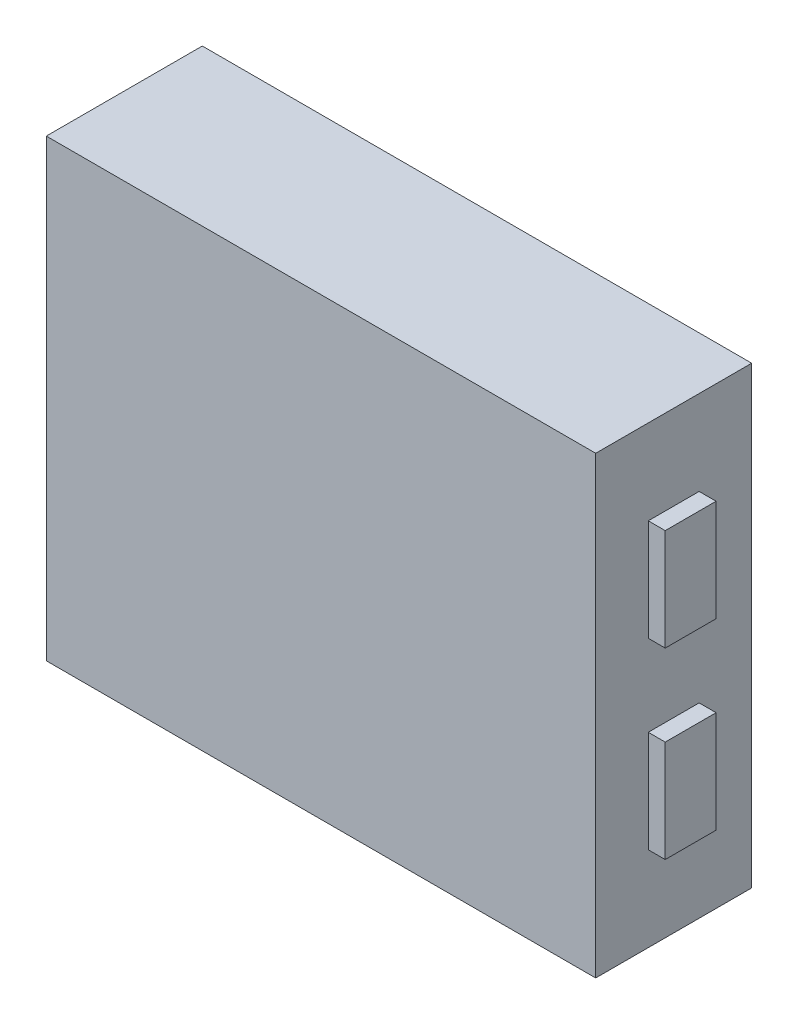
ISO-10303-21;
HEADER;
FILE_DESCRIPTION(('STEP AP214'),'2;1');
FILE_NAME('part.step','',(''),(''),'','','');
FILE_SCHEMA(('AUTOMOTIVE_DESIGN { 1 0 10303 214 1 1 1 1 }'));
ENDSEC;
DATA;
#1=APPLICATION_CONTEXT('core data for automotive mechanical design processes');
#2=APPLICATION_PROTOCOL_DEFINITION('international standard','automotive_design',2000,#1);
#3=PRODUCT_CONTEXT('',#1,'mechanical');
#4=PRODUCT('Part','Part','',(#3));
#5=PRODUCT_RELATED_PRODUCT_CATEGORY('part','',(#4));
#6=PRODUCT_DEFINITION_FORMATION('','',#4);
#7=PRODUCT_DEFINITION_CONTEXT('part definition',#1,'design');
#8=PRODUCT_DEFINITION('design','',#6,#7);
#9=PRODUCT_DEFINITION_SHAPE('','',#8);
#10=(LENGTH_UNIT() NAMED_UNIT(*) SI_UNIT(.MILLI.,.METRE.));
#11=(NAMED_UNIT(*) PLANE_ANGLE_UNIT() SI_UNIT($,.RADIAN.));
#12=(NAMED_UNIT(*) SI_UNIT($,.STERADIAN.) SOLID_ANGLE_UNIT());
#13=UNCERTAINTY_MEASURE_WITH_UNIT(LENGTH_MEASURE(1.E-05),#10,'distance_accuracy_value','');
#14=(GEOMETRIC_REPRESENTATION_CONTEXT(3) GLOBAL_UNCERTAINTY_ASSIGNED_CONTEXT((#13)) GLOBAL_UNIT_ASSIGNED_CONTEXT((#10,
#11,#12)) REPRESENTATION_CONTEXT('',''));
#15=CARTESIAN_POINT('',(0.,0.,0.));
#16=DIRECTION('',(0.,0.,1.));
#17=DIRECTION('',(1.,0.,0.));
#18=AXIS2_PLACEMENT_3D('',#15,#16,#17);
#19=CARTESIAN_POINT('',(113.209731543624,31.1224832214765,46.));
#20=DIRECTION('',(-1.,0.,0.));
#21=DIRECTION('',(0.,-1.,0.));
#22=AXIS2_PLACEMENT_3D('',#19,#20,#21);
#23=PLANE('',#22);
#24=DIRECTION('',(0.,1.,0.));
#25=VECTOR('',#24,1.);
#26=CARTESIAN_POINT('',(113.209731543624,6.12248322147652,15.5));
#27=LINE('',#26,#25);
#28=CARTESIAN_POINT('',(113.209731543624,-23.8775167785235,15.5));
#29=VERTEX_POINT('',#28);
#30=CARTESIAN_POINT('',(113.209731543624,6.12248322147652,15.5));
#31=VERTEX_POINT('',#30);
#32=EDGE_CURVE('E143',#29,#31,#27,.T.);
#33=ORIENTED_EDGE('',*,*,#32,.F.);
#34=DIRECTION('',(0.,0.,-1.));
#35=VECTOR('',#34,1.);
#36=CARTESIAN_POINT('',(113.209731543624,-23.8775167785235,30.5));
#37=LINE('',#36,#35);
#38=CARTESIAN_POINT('',(113.209731543624,-23.8775167785235,30.5));
#39=VERTEX_POINT('',#38);
#40=EDGE_CURVE('E156',#39,#29,#37,.T.);
#41=ORIENTED_EDGE('',*,*,#40,.F.);
#42=DIRECTION('',(0.,-1.,0.));
#43=VECTOR('',#42,1.);
#44=CARTESIAN_POINT('',(113.209731543624,6.12248322147652,30.5));
#45=LINE('',#44,#43);
#46=CARTESIAN_POINT('',(113.209731543624,6.12248322147652,30.5));
#47=VERTEX_POINT('',#46);
#48=EDGE_CURVE('E165',#47,#39,#45,.T.);
#49=ORIENTED_EDGE('',*,*,#48,.F.);
#50=DIRECTION('',(0.,0.,1.));
#51=VECTOR('',#50,1.);
#52=CARTESIAN_POINT('',(113.209731543624,6.12248322147652,30.5));
#53=LINE('',#52,#51);
#54=EDGE_CURVE('E146',#31,#47,#53,.T.);
#55=ORIENTED_EDGE('',*,*,#54,.F.);
#56=EDGE_LOOP('',(#33,#41,#49,#55));
#57=FACE_BOUND('',#56,.T.);
#58=DIRECTION('',(0.,1.,0.));
#59=VECTOR('',#58,1.);
#60=CARTESIAN_POINT('',(113.209731543624,31.1224832214765,0.));
#61=LINE('',#60,#59);
#62=CARTESIAN_POINT('',(113.209731543624,-102.877516778523,0.));
#63=VERTEX_POINT('',#62);
#64=CARTESIAN_POINT('',(113.209731543624,31.1224832214765,0.));
#65=VERTEX_POINT('',#64);
#66=EDGE_CURVE('E197',#63,#65,#61,.T.);
#67=ORIENTED_EDGE('',*,*,#66,.T.);
#68=DIRECTION('',(0.,0.,-1.));
#69=VECTOR('',#68,1.);
#70=CARTESIAN_POINT('',(113.209731543624,31.1224832214765,46.));
#71=LINE('',#70,#69);
#72=CARTESIAN_POINT('',(113.209731543624,31.1224832214765,46.));
#73=VERTEX_POINT('',#72);
#74=EDGE_CURVE('E202',#73,#65,#71,.T.);
#75=ORIENTED_EDGE('',*,*,#74,.F.);
#76=DIRECTION('',(0.,1.,0.));
#77=VECTOR('',#76,1.);
#78=CARTESIAN_POINT('',(113.209731543624,31.1224832214765,46.));
#79=LINE('',#78,#77);
#80=CARTESIAN_POINT('',(113.209731543624,-102.877516778523,46.));
#81=VERTEX_POINT('',#80);
#82=EDGE_CURVE('E188',#81,#73,#79,.T.);
#83=ORIENTED_EDGE('',*,*,#82,.F.);
#84=DIRECTION('',(0.,0.,-1.));
#85=VECTOR('',#84,1.);
#86=CARTESIAN_POINT('',(113.209731543624,-102.877516778523,46.));
#87=LINE('',#86,#85);
#88=EDGE_CURVE('E41',#81,#63,#87,.T.);
#89=ORIENTED_EDGE('',*,*,#88,.T.);
#90=EDGE_LOOP('',(#67,#75,#83,#89));
#91=FACE_BOUND('',#90,.T.);
#92=DIRECTION('',(0.,-1.,0.));
#93=VECTOR('',#92,1.);
#94=CARTESIAN_POINT('',(113.209731543624,-77.8775167785235,30.5));
#95=LINE('',#94,#93);
#96=CARTESIAN_POINT('',(113.209731543624,-47.8775167785235,30.5));
#97=VERTEX_POINT('',#96);
#98=CARTESIAN_POINT('',(113.209731543624,-77.8775167785235,30.5));
#99=VERTEX_POINT('',#98);
#100=EDGE_CURVE('E142',#97,#99,#95,.T.);
#101=ORIENTED_EDGE('',*,*,#100,.F.);
#102=DIRECTION('',(0.,0.,1.));
#103=VECTOR('',#102,1.);
#104=CARTESIAN_POINT('',(113.209731543624,-47.8775167785235,30.5));
#105=LINE('',#104,#103);
#106=CARTESIAN_POINT('',(113.209731543624,-47.8775167785235,15.5));
#107=VERTEX_POINT('',#106);
#108=EDGE_CURVE('E139',#107,#97,#105,.T.);
#109=ORIENTED_EDGE('',*,*,#108,.F.);
#110=DIRECTION('',(0.,1.,0.));
#111=VECTOR('',#110,1.);
#112=CARTESIAN_POINT('',(113.209731543624,-77.8775167785235,15.5));
#113=LINE('',#112,#111);
#114=CARTESIAN_POINT('',(113.209731543624,-77.8775167785235,15.5));
#115=VERTEX_POINT('',#114);
#116=EDGE_CURVE('E53',#115,#107,#113,.T.);
#117=ORIENTED_EDGE('',*,*,#116,.F.);
#118=DIRECTION('',(0.,0.,-1.));
#119=VECTOR('',#118,1.);
#120=CARTESIAN_POINT('',(113.209731543624,-77.8775167785235,30.5));
#121=LINE('',#120,#119);
#122=EDGE_CURVE('E48',#99,#115,#121,.T.);
#123=ORIENTED_EDGE('',*,*,#122,.F.);
#124=EDGE_LOOP('',(#101,#109,#117,#123));
#125=FACE_BOUND('',#124,.T.);
#126=ADVANCED_FACE('F33',(#57,#91,#125),#23,.F.);
#127=CARTESIAN_POINT('',(-48.7902684563758,31.1224832214765,46.));
#128=DIRECTION('',(1.,0.,0.));
#129=DIRECTION('',(0.,1.,0.));
#130=AXIS2_PLACEMENT_3D('',#127,#128,#129);
#131=PLANE('',#130);
#132=DIRECTION('',(0.,-1.,0.));
#133=VECTOR('',#132,1.);
#134=CARTESIAN_POINT('',(-48.7902684563758,31.1224832214765,0.));
#135=LINE('',#134,#133);
#136=CARTESIAN_POINT('',(-48.7902684563758,31.1224832214765,0.));
#137=VERTEX_POINT('',#136);
#138=CARTESIAN_POINT('',(-48.7902684563758,-102.877516778523,0.));
#139=VERTEX_POINT('',#138);
#140=EDGE_CURVE('E181',#137,#139,#135,.T.);
#141=ORIENTED_EDGE('',*,*,#140,.T.);
#142=DIRECTION('',(0.,0.,-1.));
#143=VECTOR('',#142,1.);
#144=CARTESIAN_POINT('',(-48.7902684563758,-102.877516778523,46.));
#145=LINE('',#144,#143);
#146=CARTESIAN_POINT('',(-48.7902684563758,-102.877516778523,46.));
#147=VERTEX_POINT('',#146);
#148=EDGE_CURVE('E11',#147,#139,#145,.T.);
#149=ORIENTED_EDGE('',*,*,#148,.F.);
#150=DIRECTION('',(0.,-1.,0.));
#151=VECTOR('',#150,1.);
#152=CARTESIAN_POINT('',(-48.7902684563758,31.1224832214765,46.));
#153=LINE('',#152,#151);
#154=CARTESIAN_POINT('',(-48.7902684563758,31.1224832214765,46.));
#155=VERTEX_POINT('',#154);
#156=EDGE_CURVE('E182',#155,#147,#153,.T.);
#157=ORIENTED_EDGE('',*,*,#156,.F.);
#158=DIRECTION('',(0.,0.,-1.));
#159=VECTOR('',#158,1.);
#160=CARTESIAN_POINT('',(-48.7902684563758,31.1224832214765,46.));
#161=LINE('',#160,#159);
#162=EDGE_CURVE('E192',#155,#137,#161,.T.);
#163=ORIENTED_EDGE('',*,*,#162,.T.);
#164=EDGE_LOOP('',(#141,#149,#157,#163));
#165=FACE_BOUND('',#164,.T.);
#166=ADVANCED_FACE('F35',(#165),#131,.F.);
#167=CARTESIAN_POINT('',(-48.7902684563758,-102.877516778523,46.));
#168=DIRECTION('',(0.,1.,0.));
#169=DIRECTION('',(0.,0.,1.));
#170=AXIS2_PLACEMENT_3D('',#167,#168,#169);
#171=PLANE('',#170);
#172=DIRECTION('',(1.,0.,0.));
#173=VECTOR('',#172,1.);
#174=CARTESIAN_POINT('',(-48.7902684563758,-102.877516778523,0.));
#175=LINE('',#174,#173);
#176=EDGE_CURVE('E195',#139,#63,#175,.T.);
#177=ORIENTED_EDGE('',*,*,#176,.T.);
#178=ORIENTED_EDGE('',*,*,#88,.F.);
#179=DIRECTION('',(1.,0.,0.));
#180=VECTOR('',#179,1.);
#181=CARTESIAN_POINT('',(-48.7902684563758,-102.877516778523,46.));
#182=LINE('',#181,#180);
#183=EDGE_CURVE('E185',#147,#81,#182,.T.);
#184=ORIENTED_EDGE('',*,*,#183,.F.);
#185=ORIENTED_EDGE('',*,*,#148,.T.);
#186=EDGE_LOOP('',(#177,#178,#184,#185));
#187=FACE_BOUND('',#186,.T.);
#188=ADVANCED_FACE('F224',(#187),#171,.F.);
#189=CARTESIAN_POINT('',(-48.7902684563758,31.1224832214765,46.));
#190=DIRECTION('',(0.,-1.,0.));
#191=DIRECTION('',(0.,0.,-1.));
#192=AXIS2_PLACEMENT_3D('',#189,#190,#191);
#193=PLANE('',#192);
#194=DIRECTION('',(-1.,0.,0.));
#195=VECTOR('',#194,1.);
#196=CARTESIAN_POINT('',(-48.7902684563758,31.1224832214765,0.));
#197=LINE('',#196,#195);
#198=EDGE_CURVE('E186',#65,#137,#197,.T.);
#199=ORIENTED_EDGE('',*,*,#198,.T.);
#200=ORIENTED_EDGE('',*,*,#162,.F.);
#201=DIRECTION('',(-1.,0.,0.));
#202=VECTOR('',#201,1.);
#203=CARTESIAN_POINT('',(-48.7902684563758,31.1224832214765,46.));
#204=LINE('',#203,#202);
#205=EDGE_CURVE('E190',#73,#155,#204,.T.);
#206=ORIENTED_EDGE('',*,*,#205,.F.);
#207=ORIENTED_EDGE('',*,*,#74,.T.);
#208=EDGE_LOOP('',(#199,#200,#206,#207));
#209=FACE_BOUND('',#208,.T.);
#210=ADVANCED_FACE('F217',(#209),#193,.F.);
#211=CARTESIAN_POINT('',(0.,0.,46.));
#212=DIRECTION('',(0.,0.,1.));
#213=DIRECTION('',(1.,0.,0.));
#214=AXIS2_PLACEMENT_3D('',#211,#212,#213);
#215=PLANE('',#214);
#216=ORIENTED_EDGE('',*,*,#156,.T.);
#217=ORIENTED_EDGE('',*,*,#183,.T.);
#218=ORIENTED_EDGE('',*,*,#82,.T.);
#219=ORIENTED_EDGE('',*,*,#205,.T.);
#220=EDGE_LOOP('',(#216,#217,#218,#219));
#221=FACE_BOUND('',#220,.T.);
#222=ADVANCED_FACE('F223',(#221),#215,.T.);
#223=CARTESIAN_POINT('',(0.,0.,0.));
#224=DIRECTION('',(0.,0.,1.));
#225=DIRECTION('',(1.,0.,0.));
#226=AXIS2_PLACEMENT_3D('',#223,#224,#225);
#227=PLANE('',#226);
#228=ORIENTED_EDGE('',*,*,#140,.F.);
#229=ORIENTED_EDGE('',*,*,#198,.F.);
#230=ORIENTED_EDGE('',*,*,#66,.F.);
#231=ORIENTED_EDGE('',*,*,#176,.F.);
#232=EDGE_LOOP('',(#228,#229,#230,#231));
#233=FACE_BOUND('',#232,.T.);
#234=ADVANCED_FACE('F214',(#233),#227,.F.);
#235=CARTESIAN_POINT('',(118.209731543624,6.12248322147652,15.5));
#236=DIRECTION('',(0.,0.,1.));
#237=DIRECTION('',(0.,-1.,0.));
#238=AXIS2_PLACEMENT_3D('',#235,#236,#237);
#239=PLANE('',#238);
#240=ORIENTED_EDGE('',*,*,#32,.T.);
#241=DIRECTION('',(-1.,0.,0.));
#242=VECTOR('',#241,1.);
#243=CARTESIAN_POINT('',(118.209731543624,6.12248322147652,15.5));
#244=LINE('',#243,#242);
#245=CARTESIAN_POINT('',(118.209731543624,6.12248322147652,15.5));
#246=VERTEX_POINT('',#245);
#247=EDGE_CURVE('E178',#246,#31,#244,.T.);
#248=ORIENTED_EDGE('',*,*,#247,.F.);
#249=DIRECTION('',(0.,1.,0.));
#250=VECTOR('',#249,1.);
#251=CARTESIAN_POINT('',(118.209731543624,6.12248322147652,15.5));
#252=LINE('',#251,#250);
#253=CARTESIAN_POINT('',(118.209731543624,-23.8775167785235,15.5));
#254=VERTEX_POINT('',#253);
#255=EDGE_CURVE('E152',#254,#246,#252,.T.);
#256=ORIENTED_EDGE('',*,*,#255,.F.);
#257=DIRECTION('',(-1.,0.,0.));
#258=VECTOR('',#257,1.);
#259=CARTESIAN_POINT('',(118.209731543624,-23.8775167785235,15.5));
#260=LINE('',#259,#258);
#261=EDGE_CURVE('E161',#254,#29,#260,.T.);
#262=ORIENTED_EDGE('',*,*,#261,.T.);
#263=EDGE_LOOP('',(#240,#248,#256,#262));
#264=FACE_BOUND('',#263,.T.);
#265=ADVANCED_FACE('F239',(#264),#239,.F.);
#266=CARTESIAN_POINT('',(118.209731543624,6.12248322147652,30.5));
#267=DIRECTION('',(0.,-1.,0.));
#268=DIRECTION('',(1.,0.,0.));
#269=AXIS2_PLACEMENT_3D('',#266,#267,#268);
#270=PLANE('',#269);
#271=ORIENTED_EDGE('',*,*,#54,.T.);
#272=DIRECTION('',(-1.,0.,0.));
#273=VECTOR('',#272,1.);
#274=CARTESIAN_POINT('',(118.209731543624,6.12248322147652,30.5));
#275=LINE('',#274,#273);
#276=CARTESIAN_POINT('',(118.209731543624,6.12248322147652,30.5));
#277=VERTEX_POINT('',#276);
#278=EDGE_CURVE('E175',#277,#47,#275,.T.);
#279=ORIENTED_EDGE('',*,*,#278,.F.);
#280=DIRECTION('',(0.,0.,1.));
#281=VECTOR('',#280,1.);
#282=CARTESIAN_POINT('',(118.209731543624,6.12248322147652,30.5));
#283=LINE('',#282,#281);
#284=EDGE_CURVE('E155',#246,#277,#283,.T.);
#285=ORIENTED_EDGE('',*,*,#284,.F.);
#286=ORIENTED_EDGE('',*,*,#247,.T.);
#287=EDGE_LOOP('',(#271,#279,#285,#286));
#288=FACE_BOUND('',#287,.T.);
#289=ADVANCED_FACE('F244',(#288),#270,.F.);
#290=CARTESIAN_POINT('',(118.209731543624,6.12248322147652,30.5));
#291=DIRECTION('',(0.,0.,-1.));
#292=DIRECTION('',(0.,1.,0.));
#293=AXIS2_PLACEMENT_3D('',#290,#291,#292);
#294=PLANE('',#293);
#295=ORIENTED_EDGE('',*,*,#48,.T.);
#296=DIRECTION('',(-1.,0.,0.));
#297=VECTOR('',#296,1.);
#298=CARTESIAN_POINT('',(118.209731543624,-23.8775167785235,30.5));
#299=LINE('',#298,#297);
#300=CARTESIAN_POINT('',(118.209731543624,-23.8775167785235,30.5));
#301=VERTEX_POINT('',#300);
#302=EDGE_CURVE('E172',#301,#39,#299,.T.);
#303=ORIENTED_EDGE('',*,*,#302,.F.);
#304=DIRECTION('',(0.,-1.,0.));
#305=VECTOR('',#304,1.);
#306=CARTESIAN_POINT('',(118.209731543624,6.12248322147652,30.5));
#307=LINE('',#306,#305);
#308=EDGE_CURVE('E158',#277,#301,#307,.T.);
#309=ORIENTED_EDGE('',*,*,#308,.F.);
#310=ORIENTED_EDGE('',*,*,#278,.T.);
#311=EDGE_LOOP('',(#295,#303,#309,#310));
#312=FACE_BOUND('',#311,.T.);
#313=ADVANCED_FACE('F248',(#312),#294,.F.);
#314=CARTESIAN_POINT('',(118.209731543624,-23.8775167785235,30.5));
#315=DIRECTION('',(0.,1.,0.));
#316=DIRECTION('',(-1.,0.,0.));
#317=AXIS2_PLACEMENT_3D('',#314,#315,#316);
#318=PLANE('',#317);
#319=ORIENTED_EDGE('',*,*,#40,.T.);
#320=ORIENTED_EDGE('',*,*,#261,.F.);
#321=DIRECTION('',(0.,0.,-1.));
#322=VECTOR('',#321,1.);
#323=CARTESIAN_POINT('',(118.209731543624,-23.8775167785235,30.5));
#324=LINE('',#323,#322);
#325=EDGE_CURVE('E160',#301,#254,#324,.T.);
#326=ORIENTED_EDGE('',*,*,#325,.F.);
#327=ORIENTED_EDGE('',*,*,#302,.T.);
#328=EDGE_LOOP('',(#319,#320,#326,#327));
#329=FACE_BOUND('',#328,.T.);
#330=ADVANCED_FACE('F252',(#329),#318,.F.);
#331=CARTESIAN_POINT('',(118.209731543624,0.,0.));
#332=DIRECTION('',(1.,0.,0.));
#333=DIRECTION('',(0.,1.,0.));
#334=AXIS2_PLACEMENT_3D('',#331,#332,#333);
#335=PLANE('',#334);
#336=ORIENTED_EDGE('',*,*,#255,.T.);
#337=ORIENTED_EDGE('',*,*,#284,.T.);
#338=ORIENTED_EDGE('',*,*,#308,.T.);
#339=ORIENTED_EDGE('',*,*,#325,.T.);
#340=EDGE_LOOP('',(#336,#337,#338,#339));
#341=FACE_BOUND('',#340,.T.);
#342=ADVANCED_FACE('F256',(#341),#335,.T.);
#343=CARTESIAN_POINT('',(118.209731543624,-77.8775167785235,30.5));
#344=DIRECTION('',(0.,0.,-1.));
#345=DIRECTION('',(0.,1.,0.));
#346=AXIS2_PLACEMENT_3D('',#343,#344,#345);
#347=PLANE('',#346);
#348=ORIENTED_EDGE('',*,*,#100,.T.);
#349=DIRECTION('',(-1.,0.,0.));
#350=VECTOR('',#349,1.);
#351=CARTESIAN_POINT('',(118.209731543624,-77.8775167785235,30.5));
#352=LINE('',#351,#350);
#353=CARTESIAN_POINT('',(118.209731543624,-77.8775167785235,30.5));
#354=VERTEX_POINT('',#353);
#355=EDGE_CURVE('E123',#354,#99,#352,.T.);
#356=ORIENTED_EDGE('',*,*,#355,.F.);
#357=DIRECTION('',(0.,-1.,0.));
#358=VECTOR('',#357,1.);
#359=CARTESIAN_POINT('',(118.209731543624,-77.8775167785235,30.5));
#360=LINE('',#359,#358);
#361=CARTESIAN_POINT('',(118.209731543624,-47.8775167785235,30.5));
#362=VERTEX_POINT('',#361);
#363=EDGE_CURVE('E130',#362,#354,#360,.T.);
#364=ORIENTED_EDGE('',*,*,#363,.F.);
#365=DIRECTION('',(-1.,0.,0.));
#366=VECTOR('',#365,1.);
#367=CARTESIAN_POINT('',(118.209731543624,-47.8775167785235,30.5));
#368=LINE('',#367,#366);
#369=EDGE_CURVE('E368',#362,#97,#368,.T.);
#370=ORIENTED_EDGE('',*,*,#369,.T.);
#371=EDGE_LOOP('',(#348,#356,#364,#370));
#372=FACE_BOUND('',#371,.T.);
#373=ADVANCED_FACE('F141',(#372),#347,.F.);
#374=CARTESIAN_POINT('',(118.209731543624,-77.8775167785235,30.5));
#375=DIRECTION('',(0.,1.,0.));
#376=DIRECTION('',(-1.,0.,0.));
#377=AXIS2_PLACEMENT_3D('',#374,#375,#376);
#378=PLANE('',#377);
#379=ORIENTED_EDGE('',*,*,#122,.T.);
#380=DIRECTION('',(-1.,0.,0.));
#381=VECTOR('',#380,1.);
#382=CARTESIAN_POINT('',(118.209731543624,-77.8775167785235,15.5));
#383=LINE('',#382,#381);
#384=CARTESIAN_POINT('',(118.209731543624,-77.8775167785235,15.5));
#385=VERTEX_POINT('',#384);
#386=EDGE_CURVE('E126',#385,#115,#383,.T.);
#387=ORIENTED_EDGE('',*,*,#386,.F.);
#388=DIRECTION('',(0.,0.,-1.));
#389=VECTOR('',#388,1.);
#390=CARTESIAN_POINT('',(118.209731543624,-77.8775167785235,30.5));
#391=LINE('',#390,#389);
#392=EDGE_CURVE('E119',#354,#385,#391,.T.);
#393=ORIENTED_EDGE('',*,*,#392,.F.);
#394=ORIENTED_EDGE('',*,*,#355,.T.);
#395=EDGE_LOOP('',(#379,#387,#393,#394));
#396=FACE_BOUND('',#395,.T.);
#397=ADVANCED_FACE('F121',(#396),#378,.F.);
#398=CARTESIAN_POINT('',(118.209731543624,-77.8775167785235,15.5));
#399=DIRECTION('',(0.,0.,1.));
#400=DIRECTION('',(0.,-1.,0.));
#401=AXIS2_PLACEMENT_3D('',#398,#399,#400);
#402=PLANE('',#401);
#403=ORIENTED_EDGE('',*,*,#116,.T.);
#404=DIRECTION('',(-1.,0.,0.));
#405=VECTOR('',#404,1.);
#406=CARTESIAN_POINT('',(118.209731543624,-47.8775167785235,15.5));
#407=LINE('',#406,#405);
#408=CARTESIAN_POINT('',(118.209731543624,-47.8775167785235,15.5));
#409=VERTEX_POINT('',#408);
#410=EDGE_CURVE('E148',#409,#107,#407,.T.);
#411=ORIENTED_EDGE('',*,*,#410,.F.);
#412=DIRECTION('',(0.,1.,0.));
#413=VECTOR('',#412,1.);
#414=CARTESIAN_POINT('',(118.209731543624,-77.8775167785235,15.5));
#415=LINE('',#414,#413);
#416=EDGE_CURVE('E129',#385,#409,#415,.T.);
#417=ORIENTED_EDGE('',*,*,#416,.F.);
#418=ORIENTED_EDGE('',*,*,#386,.T.);
#419=EDGE_LOOP('',(#403,#411,#417,#418));
#420=FACE_BOUND('',#419,.T.);
#421=ADVANCED_FACE('F265',(#420),#402,.F.);
#422=CARTESIAN_POINT('',(118.209731543624,-47.8775167785235,30.5));
#423=DIRECTION('',(0.,-1.,0.));
#424=DIRECTION('',(1.,0.,0.));
#425=AXIS2_PLACEMENT_3D('',#422,#423,#424);
#426=PLANE('',#425);
#427=ORIENTED_EDGE('',*,*,#108,.T.);
#428=ORIENTED_EDGE('',*,*,#369,.F.);
#429=DIRECTION('',(0.,0.,1.));
#430=VECTOR('',#429,1.);
#431=CARTESIAN_POINT('',(118.209731543624,-47.8775167785235,30.5));
#432=LINE('',#431,#430);
#433=EDGE_CURVE('E135',#409,#362,#432,.T.);
#434=ORIENTED_EDGE('',*,*,#433,.F.);
#435=ORIENTED_EDGE('',*,*,#410,.T.);
#436=EDGE_LOOP('',(#427,#428,#434,#435));
#437=FACE_BOUND('',#436,.T.);
#438=ADVANCED_FACE('F268',(#437),#426,.F.);
#439=CARTESIAN_POINT('',(118.209731543624,0.,0.));
#440=DIRECTION('',(-1.,0.,0.));
#441=DIRECTION('',(0.,-1.,0.));
#442=AXIS2_PLACEMENT_3D('',#439,#440,#441);
#443=PLANE('',#442);
#444=ORIENTED_EDGE('',*,*,#363,.T.);
#445=ORIENTED_EDGE('',*,*,#392,.T.);
#446=ORIENTED_EDGE('',*,*,#416,.T.);
#447=ORIENTED_EDGE('',*,*,#433,.T.);
#448=EDGE_LOOP('',(#444,#445,#446,#447));
#449=FACE_BOUND('',#448,.T.);
#450=ADVANCED_FACE('F133',(#449),#443,.F.);
#451=CLOSED_SHELL('',(#126,#166,#188,#210,#222,#234,#265,#289,#313,#330,#342,#373,#397,#421,
#438,#450));
#452=MANIFOLD_SOLID_BREP('B2',#451);
#453=ADVANCED_BREP_SHAPE_REPRESENTATION('',(#18,#452),#14);
#454=SHAPE_DEFINITION_REPRESENTATION(#9,#453);
ENDSEC;
END-ISO-10303-21;
